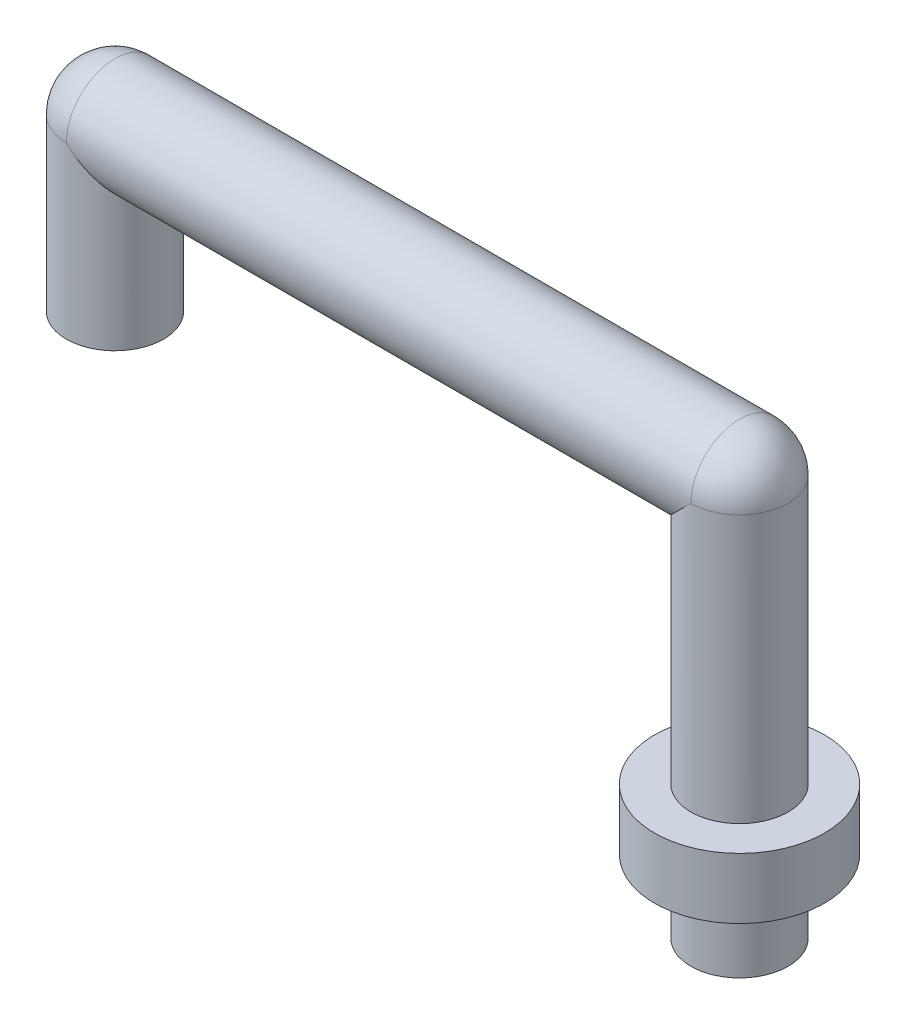
ISO-10303-21;
HEADER;
FILE_DESCRIPTION(('STEP AP214'),'2;1');
FILE_NAME('part.step','',(''),(''),'','','');
FILE_SCHEMA(('AUTOMOTIVE_DESIGN { 1 0 10303 214 1 1 1 1 }'));
ENDSEC;
DATA;
#1=APPLICATION_CONTEXT('core data for automotive mechanical design processes');
#2=APPLICATION_PROTOCOL_DEFINITION('international standard','automotive_design',2000,#1);
#3=PRODUCT_CONTEXT('',#1,'mechanical');
#4=PRODUCT('Part','Part','',(#3));
#5=PRODUCT_RELATED_PRODUCT_CATEGORY('part','',(#4));
#6=PRODUCT_DEFINITION_FORMATION('','',#4);
#7=PRODUCT_DEFINITION_CONTEXT('part definition',#1,'design');
#8=PRODUCT_DEFINITION('design','',#6,#7);
#9=PRODUCT_DEFINITION_SHAPE('','',#8);
#10=(LENGTH_UNIT() NAMED_UNIT(*) SI_UNIT(.MILLI.,.METRE.));
#11=(NAMED_UNIT(*) PLANE_ANGLE_UNIT() SI_UNIT($,.RADIAN.));
#12=(NAMED_UNIT(*) SI_UNIT($,.STERADIAN.) SOLID_ANGLE_UNIT());
#13=UNCERTAINTY_MEASURE_WITH_UNIT(LENGTH_MEASURE(1.E-05),#10,'distance_accuracy_value','');
#14=(GEOMETRIC_REPRESENTATION_CONTEXT(3) GLOBAL_UNCERTAINTY_ASSIGNED_CONTEXT((#13)) GLOBAL_UNIT_ASSIGNED_CONTEXT((#10,
#11,#12)) REPRESENTATION_CONTEXT('',''));
#15=CARTESIAN_POINT('',(0.,0.,0.));
#16=DIRECTION('',(0.,0.,1.));
#17=DIRECTION('',(1.,0.,0.));
#18=AXIS2_PLACEMENT_3D('',#15,#16,#17);
#19=CARTESIAN_POINT('',(0.,41.91,0.));
#20=DIRECTION('',(0.,-1.,0.));
#21=DIRECTION('',(0.,0.,-0.999999999999991));
#22=AXIS2_PLACEMENT_3D('',#19,#20,#21);
#23=CYLINDRICAL_SURFACE('',#22,5.08);
#24=CARTESIAN_POINT('',(-1.31838984174237E-13,13.97,0.));
#25=DIRECTION('',(0.,-1.,0.));
#26=DIRECTION('',(0.,0.,-0.999999999999991));
#27=AXIS2_PLACEMENT_3D('',#24,#25,#26);
#28=CIRCLE('',#27,5.08);
#29=CARTESIAN_POINT('',(-1.22251098133574E-13,13.97,-5.07999999999993));
#30=VERTEX_POINT('',#29);
#31=EDGE_CURVE('E11',#30,#30,#28,.T.);
#32=ORIENTED_EDGE('',*,*,#31,.F.);
#33=EDGE_LOOP('',(#32));
#34=FACE_BOUND('',#33,.T.);
#35=CARTESIAN_POINT('',(0.,41.91,0.));
#36=DIRECTION('',(0.707106781186547,-0.707106781186547,0.));
#37=DIRECTION('',(-0.707106781186544,-0.707106781186544,0.));
#38=AXIS2_PLACEMENT_3D('',#35,#36,#37);
#39=ELLIPSE('',#38,7.18420489685532,5.08);
#40=CARTESIAN_POINT('',(0.,41.9099999999999,-5.07999999999995));
#41=VERTEX_POINT('',#40);
#42=CARTESIAN_POINT('',(0.,41.91,5.08000000000003));
#43=VERTEX_POINT('',#42);
#44=EDGE_CURVE('E96',#41,#43,#39,.F.);
#45=ORIENTED_EDGE('',*,*,#44,.F.);
#46=CARTESIAN_POINT('',(0.,41.91,0.));
#47=DIRECTION('',(0.,1.,0.));
#48=DIRECTION('',(0.,0.,0.999999999999991));
#49=AXIS2_PLACEMENT_3D('',#46,#47,#48);
#50=CIRCLE('',#49,5.08);
#51=EDGE_CURVE('E64',#43,#41,#50,.T.);
#52=ORIENTED_EDGE('',*,*,#51,.F.);
#53=EDGE_LOOP('',(#45,#52));
#54=FACE_BOUND('',#53,.T.);
#55=ADVANCED_FACE('F43',(#34,#54),#23,.T.);
#56=CARTESIAN_POINT('',(-8.89000000000004,13.97,0.));
#57=DIRECTION('',(0.,-1.,0.));
#58=DIRECTION('',(0.,0.,-0.999999999999991));
#59=AXIS2_PLACEMENT_3D('',#56,#57,#58);
#60=PLANE('',#59);
#61=ORIENTED_EDGE('',*,*,#31,.T.);
#62=EDGE_LOOP('',(#61));
#63=FACE_BOUND('',#62,.T.);
#64=CARTESIAN_POINT('',(-1.31838984174237E-13,13.97,0.));
#65=DIRECTION('',(0.,-1.,0.));
#66=DIRECTION('',(0.,0.,-0.999999999999991));
#67=AXIS2_PLACEMENT_3D('',#64,#65,#66);
#68=CIRCLE('',#67,8.89);
#69=CARTESIAN_POINT('',(0.,13.97,-8.88999999999992));
#70=VERTEX_POINT('',#69);
#71=EDGE_CURVE('E103',#70,#70,#68,.T.);
#72=ORIENTED_EDGE('',*,*,#71,.F.);
#73=EDGE_LOOP('',(#72));
#74=FACE_BOUND('',#73,.T.);
#75=ADVANCED_FACE('F133',(#63,#74),#60,.F.);
#76=CARTESIAN_POINT('',(0.,0.,0.));
#77=DIRECTION('',(0.,-1.,0.));
#78=DIRECTION('',(0.,0.,-0.999999999999991));
#79=AXIS2_PLACEMENT_3D('',#76,#77,#78);
#80=CYLINDRICAL_SURFACE('',#79,8.89);
#81=CARTESIAN_POINT('',(0.,7.62,0.));
#82=DIRECTION('',(0.,-1.,0.));
#83=DIRECTION('',(0.,0.,-0.999999999999991));
#84=AXIS2_PLACEMENT_3D('',#81,#82,#83);
#85=CIRCLE('',#84,8.89);
#86=CARTESIAN_POINT('',(0.,7.62,-8.88999999999992));
#87=VERTEX_POINT('',#86);
#88=EDGE_CURVE('E99',#87,#87,#85,.T.);
#89=CARTESIAN_POINT('',(0.,7.62,-8.88999999999992));
#90=CARTESIAN_POINT('',(0.,7.68614583333334,-8.88999999999992));
#91=CARTESIAN_POINT('',(0.,7.75229166666667,-8.88999999999992));
#92=CARTESIAN_POINT('',(0.,7.88458333333334,-8.88999999999992));
#93=CARTESIAN_POINT('',(0.,7.95072916666667,-8.88999999999992));
#94=CARTESIAN_POINT('',(0.,8.08302083333333,-8.88999999999992));
#95=CARTESIAN_POINT('',(0.,8.14916666666667,-8.88999999999992));
#96=CARTESIAN_POINT('',(0.,8.28145833333333,-8.88999999999992));
#97=CARTESIAN_POINT('',(0.,8.34760416666667,-8.88999999999992));
#98=CARTESIAN_POINT('',(0.,8.47989583333334,-8.88999999999992));
#99=CARTESIAN_POINT('',(0.,8.54604166666667,-8.88999999999992));
#100=CARTESIAN_POINT('',(0.,8.67833333333334,-8.88999999999992));
#101=CARTESIAN_POINT('',(0.,8.74447916666667,-8.88999999999992));
#102=CARTESIAN_POINT('',(0.,8.87677083333334,-8.88999999999992));
#103=CARTESIAN_POINT('',(0.,8.94291666666667,-8.88999999999992));
#104=CARTESIAN_POINT('',(0.,9.07520833333334,-8.88999999999992));
#105=CARTESIAN_POINT('',(0.,9.14135416666667,-8.88999999999992));
#106=CARTESIAN_POINT('',(0.,9.27364583333334,-8.88999999999992));
#107=CARTESIAN_POINT('',(0.,9.33979166666667,-8.88999999999992));
#108=CARTESIAN_POINT('',(0.,9.47208333333334,-8.88999999999992));
#109=CARTESIAN_POINT('',(0.,9.53822916666667,-8.88999999999992));
#110=CARTESIAN_POINT('',(0.,9.67052083333334,-8.88999999999992));
#111=CARTESIAN_POINT('',(0.,9.73666666666667,-8.88999999999992));
#112=CARTESIAN_POINT('',(0.,9.86895833333334,-8.88999999999992));
#113=CARTESIAN_POINT('',(0.,9.93510416666667,-8.88999999999992));
#114=CARTESIAN_POINT('',(0.,10.0673958333333,-8.88999999999992));
#115=CARTESIAN_POINT('',(0.,10.1335416666667,-8.88999999999992));
#116=CARTESIAN_POINT('',(0.,10.2658333333333,-8.88999999999992));
#117=CARTESIAN_POINT('',(0.,10.3319791666667,-8.88999999999992));
#118=CARTESIAN_POINT('',(0.,10.4642708333333,-8.88999999999992));
#119=CARTESIAN_POINT('',(0.,10.5304166666667,-8.88999999999992));
#120=CARTESIAN_POINT('',(0.,10.6627083333333,-8.88999999999992));
#121=CARTESIAN_POINT('',(0.,10.7288541666667,-8.88999999999992));
#122=CARTESIAN_POINT('',(0.,10.8611458333333,-8.88999999999992));
#123=CARTESIAN_POINT('',(0.,10.9272916666667,-8.88999999999992));
#124=CARTESIAN_POINT('',(0.,11.0595833333333,-8.88999999999992));
#125=CARTESIAN_POINT('',(0.,11.1257291666667,-8.88999999999992));
#126=CARTESIAN_POINT('',(0.,11.2580208333333,-8.88999999999992));
#127=CARTESIAN_POINT('',(0.,11.3241666666667,-8.88999999999992));
#128=CARTESIAN_POINT('',(0.,11.4564583333333,-8.88999999999992));
#129=CARTESIAN_POINT('',(0.,11.5226041666667,-8.88999999999992));
#130=CARTESIAN_POINT('',(0.,11.6548958333333,-8.88999999999992));
#131=CARTESIAN_POINT('',(0.,11.7210416666667,-8.88999999999992));
#132=CARTESIAN_POINT('',(0.,11.8533333333333,-8.88999999999992));
#133=CARTESIAN_POINT('',(0.,11.9194791666667,-8.88999999999992));
#134=CARTESIAN_POINT('',(0.,12.0517708333333,-8.88999999999992));
#135=CARTESIAN_POINT('',(0.,12.1179166666667,-8.88999999999992));
#136=CARTESIAN_POINT('',(0.,12.2502083333333,-8.88999999999992));
#137=CARTESIAN_POINT('',(0.,12.3163541666667,-8.88999999999992));
#138=CARTESIAN_POINT('',(0.,12.4486458333333,-8.88999999999992));
#139=CARTESIAN_POINT('',(0.,12.5147916666667,-8.88999999999992));
#140=CARTESIAN_POINT('',(0.,12.6470833333333,-8.88999999999992));
#141=CARTESIAN_POINT('',(0.,12.7132291666667,-8.88999999999992));
#142=CARTESIAN_POINT('',(0.,12.8455208333333,-8.88999999999992));
#143=CARTESIAN_POINT('',(0.,12.9116666666667,-8.88999999999992));
#144=CARTESIAN_POINT('',(0.,13.0439583333333,-8.88999999999992));
#145=CARTESIAN_POINT('',(0.,13.1101041666667,-8.88999999999992));
#146=CARTESIAN_POINT('',(0.,13.2423958333333,-8.88999999999992));
#147=CARTESIAN_POINT('',(0.,13.3085416666667,-8.88999999999992));
#148=CARTESIAN_POINT('',(0.,13.4408333333333,-8.88999999999992));
#149=CARTESIAN_POINT('',(0.,13.5069791666667,-8.88999999999992));
#150=CARTESIAN_POINT('',(0.,13.6392708333333,-8.88999999999992));
#151=CARTESIAN_POINT('',(0.,13.7054166666667,-8.88999999999992));
#152=CARTESIAN_POINT('',(0.,13.8377083333333,-8.88999999999992));
#153=CARTESIAN_POINT('',(0.,13.9038541666667,-8.88999999999992));
#154=CARTESIAN_POINT('',(0.,13.97,-8.88999999999992));
#155=B_SPLINE_CURVE_WITH_KNOTS('',3,(#89,#90,#91,#92,#93,#94,#95,#96,#97,#98,#99,#100,#101,#102,
#103,#104,#105,#106,#107,#108,#109,#110,#111,#112,#113,#114,#115,#116,#117,#118,#119,#120,#121,
#122,#123,#124,#125,#126,#127,#128,#129,#130,#131,#132,#133,#134,#135,#136,#137,#138,#139,#140,
#141,#142,#143,#144,#145,#146,#147,#148,#149,#150,#151,#152,#153,#154),.UNSPECIFIED.,.F.,.F.,(4,
2,2,2,2,2,2,2,2,2,2,2,2,2,2,2,2,2,2,2,2,2,2,2,2,2,2,2,2,2,2,2,4),(0.,0.198437500000001,0.396875,
0.5953125,0.793750000000001,0.992187500000002,1.190625,1.3890625,1.5875,1.7859375,1.984375,
2.1828125,2.38125,2.5796875,2.778125,2.9765625,3.175,3.3734375,3.571875,3.7703125,3.96875,
4.1671875,4.365625,4.5640625,4.7625,4.9609375,5.159375,5.3578125,5.55625,5.7546875,5.953125,
6.1515625,6.35),.UNSPECIFIED.);
#156=EDGE_CURVE('BSEAM138',#87,#70,#155,.T.);
#157=ORIENTED_EDGE('',*,*,#88,.F.);
#158=ORIENTED_EDGE('',*,*,#71,.T.);
#159=ORIENTED_EDGE('',*,*,#156,.T.);
#160=ORIENTED_EDGE('',*,*,#156,.F.);
#161=EDGE_LOOP('',(#157,#159,#158,#160));
#162=FACE_BOUND('',#161,.T.);
#163=ADVANCED_FACE('F138',(#162),#80,.T.);
#164=CARTESIAN_POINT('',(0.,7.62,0.));
#165=DIRECTION('',(0.,1.,0.));
#166=DIRECTION('',(0.,0.,0.999999999999991));
#167=AXIS2_PLACEMENT_3D('',#164,#165,#166);
#168=PLANE('',#167);
#169=CARTESIAN_POINT('',(0.,7.62,0.));
#170=DIRECTION('',(0.,1.,0.));
#171=DIRECTION('',(0.,0.,0.999999999999991));
#172=AXIS2_PLACEMENT_3D('',#169,#170,#171);
#173=CIRCLE('',#172,5.08);
#174=CARTESIAN_POINT('',(0.,7.62000000000001,-5.07999999999995));
#175=VERTEX_POINT('',#174);
#176=EDGE_CURVE('E51',#175,#175,#173,.T.);
#177=ORIENTED_EDGE('',*,*,#176,.T.);
#178=EDGE_LOOP('',(#177));
#179=FACE_BOUND('',#178,.T.);
#180=ORIENTED_EDGE('',*,*,#88,.T.);
#181=EDGE_LOOP('',(#180));
#182=FACE_BOUND('',#181,.T.);
#183=ADVANCED_FACE('F118',(#179,#182),#168,.F.);
#184=CARTESIAN_POINT('',(0.,0.,0.));
#185=DIRECTION('',(0.,1.,0.));
#186=DIRECTION('',(0.,0.,0.999999999999991));
#187=AXIS2_PLACEMENT_3D('',#184,#185,#186);
#188=PLANE('',#187);
#189=CARTESIAN_POINT('',(0.,0.,0.));
#190=DIRECTION('',(0.,1.,0.));
#191=DIRECTION('',(0.,0.,0.999999999999991));
#192=AXIS2_PLACEMENT_3D('',#189,#190,#191);
#193=CIRCLE('',#192,5.08);
#194=CARTESIAN_POINT('',(0.,0.,-5.07999999999995));
#195=VERTEX_POINT('',#194);
#196=EDGE_CURVE('E107',#195,#195,#193,.T.);
#197=ORIENTED_EDGE('',*,*,#196,.F.);
#198=EDGE_LOOP('',(#197));
#199=FACE_BOUND('',#198,.T.);
#200=ADVANCED_FACE('F123',(#199),#188,.F.);
#201=CARTESIAN_POINT('',(0.,0.,-5.07999999999995));
#202=CARTESIAN_POINT('',(0.,0.0793750000000065,-5.07999999999995));
#203=CARTESIAN_POINT('',(0.,0.158750000000006,-5.07999999999995));
#204=CARTESIAN_POINT('',(0.,0.317500000000005,-5.07999999999995));
#205=CARTESIAN_POINT('',(0.,0.396875000000005,-5.07999999999995));
#206=CARTESIAN_POINT('',(0.,0.555625000000006,-5.07999999999995));
#207=CARTESIAN_POINT('',(0.,0.635000000000008,-5.07999999999995));
#208=CARTESIAN_POINT('',(0.,0.79375000000001,-5.07999999999995));
#209=CARTESIAN_POINT('',(0.,0.873125000000009,-5.07999999999995));
#210=CARTESIAN_POINT('',(0.,1.03187500000001,-5.07999999999995));
#211=CARTESIAN_POINT('',(0.,1.11125000000001,-5.07999999999995));
#212=CARTESIAN_POINT('',(0.,1.27000000000001,-5.07999999999995));
#213=CARTESIAN_POINT('',(0.,1.34937500000001,-5.07999999999995));
#214=CARTESIAN_POINT('',(0.,1.50812500000001,-5.07999999999995));
#215=CARTESIAN_POINT('',(0.,1.58750000000001,-5.07999999999995));
#216=CARTESIAN_POINT('',(0.,1.74625000000001,-5.07999999999995));
#217=CARTESIAN_POINT('',(0.,1.82562500000001,-5.07999999999995));
#218=CARTESIAN_POINT('',(0.,1.98437500000001,-5.07999999999995));
#219=CARTESIAN_POINT('',(0.,2.06375000000001,-5.07999999999995));
#220=CARTESIAN_POINT('',(0.,2.22250000000001,-5.07999999999995));
#221=CARTESIAN_POINT('',(0.,2.30187500000001,-5.07999999999995));
#222=CARTESIAN_POINT('',(0.,2.46062500000001,-5.07999999999995));
#223=CARTESIAN_POINT('',(0.,2.54000000000001,-5.07999999999995));
#224=CARTESIAN_POINT('',(0.,2.69875000000001,-5.07999999999995));
#225=CARTESIAN_POINT('',(0.,2.77812500000001,-5.07999999999995));
#226=CARTESIAN_POINT('',(0.,2.93687500000001,-5.07999999999995));
#227=CARTESIAN_POINT('',(0.,3.01625000000001,-5.07999999999995));
#228=CARTESIAN_POINT('',(0.,3.17500000000001,-5.07999999999995));
#229=CARTESIAN_POINT('',(0.,3.25437500000001,-5.07999999999995));
#230=CARTESIAN_POINT('',(0.,3.41312500000001,-5.07999999999995));
#231=CARTESIAN_POINT('',(0.,3.49250000000001,-5.07999999999995));
#232=CARTESIAN_POINT('',(0.,3.65125000000001,-5.07999999999995));
#233=CARTESIAN_POINT('',(0.,3.73062500000001,-5.07999999999995));
#234=CARTESIAN_POINT('',(0.,3.88937500000001,-5.07999999999995));
#235=CARTESIAN_POINT('',(0.,3.96875000000001,-5.07999999999995));
#236=CARTESIAN_POINT('',(0.,4.12750000000001,-5.07999999999995));
#237=CARTESIAN_POINT('',(0.,4.20687500000001,-5.07999999999995));
#238=CARTESIAN_POINT('',(0.,4.365625,-5.07999999999995));
#239=CARTESIAN_POINT('',(0.,4.445,-5.07999999999995));
#240=CARTESIAN_POINT('',(0.,4.60375000000001,-5.07999999999995));
#241=CARTESIAN_POINT('',(0.,4.68312500000001,-5.07999999999995));
#242=CARTESIAN_POINT('',(0.,4.84187500000001,-5.07999999999995));
#243=CARTESIAN_POINT('',(0.,4.92125000000001,-5.07999999999995));
#244=CARTESIAN_POINT('',(0.,5.08000000000001,-5.07999999999995));
#245=CARTESIAN_POINT('',(0.,5.15937500000001,-5.07999999999995));
#246=CARTESIAN_POINT('',(0.,5.31812500000001,-5.07999999999995));
#247=CARTESIAN_POINT('',(0.,5.39750000000001,-5.07999999999995));
#248=CARTESIAN_POINT('',(0.,5.55625000000001,-5.07999999999995));
#249=CARTESIAN_POINT('',(0.,5.63562500000001,-5.07999999999995));
#250=CARTESIAN_POINT('',(0.,5.79437500000001,-5.07999999999995));
#251=CARTESIAN_POINT('',(0.,5.87375000000001,-5.07999999999995));
#252=CARTESIAN_POINT('',(0.,6.03250000000001,-5.07999999999995));
#253=CARTESIAN_POINT('',(0.,6.11187500000001,-5.07999999999995));
#254=CARTESIAN_POINT('',(0.,6.27062500000001,-5.07999999999995));
#255=CARTESIAN_POINT('',(0.,6.35000000000001,-5.07999999999995));
#256=CARTESIAN_POINT('',(0.,6.50875000000001,-5.07999999999995));
#257=CARTESIAN_POINT('',(0.,6.58812500000001,-5.07999999999995));
#258=CARTESIAN_POINT('',(0.,6.74687500000001,-5.07999999999995));
#259=CARTESIAN_POINT('',(0.,6.82625000000001,-5.07999999999995));
#260=CARTESIAN_POINT('',(0.,6.98500000000001,-5.07999999999995));
#261=CARTESIAN_POINT('',(0.,7.06437500000001,-5.07999999999995));
#262=CARTESIAN_POINT('',(0.,7.22312500000001,-5.07999999999995));
#263=CARTESIAN_POINT('',(0.,7.30250000000001,-5.07999999999995));
#264=CARTESIAN_POINT('',(0.,7.46125000000001,-5.07999999999995));
#265=CARTESIAN_POINT('',(0.,7.54062500000001,-5.07999999999995));
#266=CARTESIAN_POINT('',(0.,7.62000000000001,-5.07999999999995));
#267=B_SPLINE_CURVE_WITH_KNOTS('',3,(#201,#202,#203,#204,#205,#206,#207,#208,#209,#210,#211,
#212,#213,#214,#215,#216,#217,#218,#219,#220,#221,#222,#223,#224,#225,#226,#227,#228,#229,#230,
#231,#232,#233,#234,#235,#236,#237,#238,#239,#240,#241,#242,#243,#244,#245,#246,#247,#248,#249,
#250,#251,#252,#253,#254,#255,#256,#257,#258,#259,#260,#261,#262,#263,#264,#265,#266),
.UNSPECIFIED.,.F.,.F.,(4,2,2,2,2,2,2,2,2,2,2,2,2,2,2,2,2,2,2,2,2,2,2,2,2,2,2,2,2,2,2,2,4),(0.,
0.238124999999999,0.476249999999998,0.714375000000003,0.952500000000002,1.190625,1.42875,
1.666875,1.905,2.143125,2.38125,2.619375,2.8575,3.095625,3.33375,3.571875,3.81,4.048125,4.28625,
4.524375,4.7625,5.000625,5.23875,5.476875,5.715,5.953125,6.19125,6.429375,6.6675,6.905625,
7.14375,7.381875,7.62),.UNSPECIFIED.);
#268=EDGE_CURVE('BSEAM121',#195,#175,#267,.T.);
#269=ORIENTED_EDGE('',*,*,#196,.T.);
#270=ORIENTED_EDGE('',*,*,#176,.F.);
#271=ORIENTED_EDGE('',*,*,#268,.T.);
#272=ORIENTED_EDGE('',*,*,#268,.F.);
#273=EDGE_LOOP('',(#269,#271,#270,#272));
#274=FACE_BOUND('',#273,.T.);
#275=ADVANCED_FACE('F121',(#274),#23,.T.);
#276=CARTESIAN_POINT('',(-65.278,41.91,0.));
#277=DIRECTION('',(-0.999999999999995,0.,0.));
#278=DIRECTION('',(0.,0.,0.999999999999991));
#279=AXIS2_PLACEMENT_3D('',#276,#277,#278);
#280=CYLINDRICAL_SURFACE('',#279,5.08);
#281=CARTESIAN_POINT('',(-65.278,41.91,0.));
#282=DIRECTION('',(-0.999999999999995,0.,0.));
#283=DIRECTION('',(0.,0.,0.999999999999991));
#284=AXIS2_PLACEMENT_3D('',#281,#282,#283);
#285=CIRCLE('',#284,5.07999999999999);
#286=CARTESIAN_POINT('',(-65.278,41.91,5.08));
#287=VERTEX_POINT('',#286);
#288=CARTESIAN_POINT('',(-65.278,41.91,-5.07999999999996));
#289=VERTEX_POINT('',#288);
#290=EDGE_CURVE('E57',#287,#289,#285,.T.);
#291=ORIENTED_EDGE('',*,*,#290,.F.);
#292=CARTESIAN_POINT('',(-65.278,41.91,0.));
#293=DIRECTION('',(-0.707106781186545,-0.707106781186546,0.));
#294=DIRECTION('',(-0.707106781186547,0.707106781186547,0.));
#295=AXIS2_PLACEMENT_3D('',#292,#293,#294);
#296=ELLIPSE('',#295,7.18420489685531,5.07999999999999);
#297=EDGE_CURVE('E69',#287,#289,#296,.F.);
#298=ORIENTED_EDGE('',*,*,#297,.T.);
#299=EDGE_LOOP('',(#291,#298));
#300=FACE_BOUND('',#299,.T.);
#301=CARTESIAN_POINT('',(0.,41.91,0.));
#302=DIRECTION('',(-0.999999999999995,0.,0.));
#303=DIRECTION('',(0.,0.,0.999999999999991));
#304=AXIS2_PLACEMENT_3D('',#301,#302,#303);
#305=CIRCLE('',#304,5.08);
#306=EDGE_CURVE('E81',#43,#41,#305,.T.);
#307=ORIENTED_EDGE('',*,*,#306,.T.);
#308=ORIENTED_EDGE('',*,*,#44,.T.);
#309=EDGE_LOOP('',(#307,#308));
#310=FACE_BOUND('',#309,.T.);
#311=ADVANCED_FACE('F70',(#300,#310),#280,.T.);
#312=CARTESIAN_POINT('',(0.,41.91,0.));
#313=DIRECTION('',(-0.999999999999995,0.,0.));
#314=DIRECTION('',(0.,0.,-0.999999999999991));
#315=AXIS2_PLACEMENT_3D('',#312,#313,#314);
#316=SPHERICAL_SURFACE('',#315,5.08);
#317=ORIENTED_EDGE('',*,*,#51,.T.);
#318=ORIENTED_EDGE('',*,*,#306,.F.);
#319=EDGE_LOOP('',(#317,#318));
#320=FACE_BOUND('',#319,.T.);
#321=ADVANCED_FACE('F129',(#320),#316,.T.);
#322=CARTESIAN_POINT('',(-65.278,41.91,0.));
#323=DIRECTION('',(0.,0.999999999999999,0.));
#324=DIRECTION('',(0.,0.,0.999999999999991));
#325=AXIS2_PLACEMENT_3D('',#322,#323,#324);
#326=SPHERICAL_SURFACE('',#325,5.07999999999999);
#327=ORIENTED_EDGE('',*,*,#290,.T.);
#328=CARTESIAN_POINT('',(-65.278,41.91,0.));
#329=DIRECTION('',(0.,0.999999999999999,0.));
#330=DIRECTION('',(0.,0.,0.999999999999991));
#331=AXIS2_PLACEMENT_3D('',#328,#329,#330);
#332=CIRCLE('',#331,5.07999999999999);
#333=EDGE_CURVE('E76',#289,#287,#332,.T.);
#334=ORIENTED_EDGE('',*,*,#333,.T.);
#335=EDGE_LOOP('',(#327,#334));
#336=FACE_BOUND('',#335,.T.);
#337=ADVANCED_FACE('F79',(#336),#326,.T.);
#338=CARTESIAN_POINT('',(-65.278,46.99,0.));
#339=DIRECTION('',(0.,0.999999999999999,0.));
#340=DIRECTION('',(0.,0.,0.999999999999991));
#341=AXIS2_PLACEMENT_3D('',#338,#339,#340);
#342=CYLINDRICAL_SURFACE('',#341,5.07999999999999);
#343=CARTESIAN_POINT('',(-65.278,24.13,0.));
#344=DIRECTION('',(0.,0.999999999999999,0.));
#345=DIRECTION('',(0.,0.,0.999999999999991));
#346=AXIS2_PLACEMENT_3D('',#343,#344,#345);
#347=CIRCLE('',#346,5.07999999999999);
#348=CARTESIAN_POINT('',(-65.278,24.13,5.07999999999995));
#349=VERTEX_POINT('',#348);
#350=EDGE_CURVE('E85',#349,#349,#347,.T.);
#351=ORIENTED_EDGE('',*,*,#350,.T.);
#352=EDGE_LOOP('',(#351));
#353=FACE_BOUND('',#352,.T.);
#354=ORIENTED_EDGE('',*,*,#297,.F.);
#355=ORIENTED_EDGE('',*,*,#333,.F.);
#356=EDGE_LOOP('',(#354,#355));
#357=FACE_BOUND('',#356,.T.);
#358=ADVANCED_FACE('F83',(#353,#357),#342,.T.);
#359=CARTESIAN_POINT('',(-65.278,24.13,-5.07999999999998));
#360=DIRECTION('',(0.,-0.999999999999999,0.));
#361=DIRECTION('',(0.,0.,-0.999999999999991));
#362=AXIS2_PLACEMENT_3D('',#359,#360,#361);
#363=PLANE('',#362);
#364=ORIENTED_EDGE('',*,*,#350,.F.);
#365=EDGE_LOOP('',(#364));
#366=FACE_BOUND('',#365,.T.);
#367=ADVANCED_FACE('F202',(#366),#363,.T.);
#368=CLOSED_SHELL('',(#55,#75,#163,#183,#200,#275,#311,#321,#337,#358,#367));
#369=MANIFOLD_SOLID_BREP('B2',#368);
#370=ADVANCED_BREP_SHAPE_REPRESENTATION('',(#18,#369),#14);
#371=SHAPE_DEFINITION_REPRESENTATION(#9,#370);
ENDSEC;
END-ISO-10303-21;
